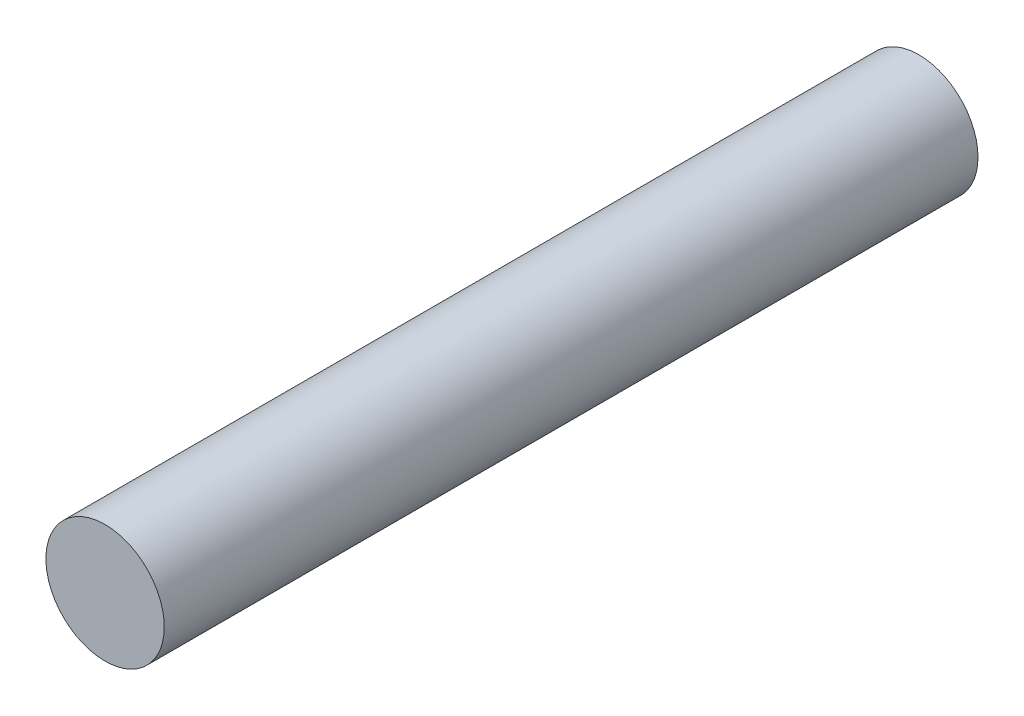
ISO-10303-21;
HEADER;
FILE_DESCRIPTION(('STEP AP214'),'2;1');
FILE_NAME('part.step','',(''),(''),'','','');
FILE_SCHEMA(('AUTOMOTIVE_DESIGN { 1 0 10303 214 1 1 1 1 }'));
ENDSEC;
DATA;
#1=APPLICATION_CONTEXT('core data for automotive mechanical design processes');
#2=APPLICATION_PROTOCOL_DEFINITION('international standard','automotive_design',2000,#1);
#3=PRODUCT_CONTEXT('',#1,'mechanical');
#4=PRODUCT('Part','Part','',(#3));
#5=PRODUCT_RELATED_PRODUCT_CATEGORY('part','',(#4));
#6=PRODUCT_DEFINITION_FORMATION('','',#4);
#7=PRODUCT_DEFINITION_CONTEXT('part definition',#1,'design');
#8=PRODUCT_DEFINITION('design','',#6,#7);
#9=PRODUCT_DEFINITION_SHAPE('','',#8);
#10=(LENGTH_UNIT() NAMED_UNIT(*) SI_UNIT(.MILLI.,.METRE.));
#11=(NAMED_UNIT(*) PLANE_ANGLE_UNIT() SI_UNIT($,.RADIAN.));
#12=(NAMED_UNIT(*) SI_UNIT($,.STERADIAN.) SOLID_ANGLE_UNIT());
#13=UNCERTAINTY_MEASURE_WITH_UNIT(LENGTH_MEASURE(1.E-05),#10,'distance_accuracy_value','');
#14=(GEOMETRIC_REPRESENTATION_CONTEXT(3) GLOBAL_UNCERTAINTY_ASSIGNED_CONTEXT((#13)) GLOBAL_UNIT_ASSIGNED_CONTEXT((#10,
#11,#12)) REPRESENTATION_CONTEXT('',''));
#15=CARTESIAN_POINT('',(0.,0.,0.));
#16=DIRECTION('',(0.,0.,1.));
#17=DIRECTION('',(1.,0.,0.));
#18=AXIS2_PLACEMENT_3D('',#15,#16,#17);
#19=CARTESIAN_POINT('',(0.,0.,55.));
#20=DIRECTION('',(0.,0.,-1.));
#21=DIRECTION('',(-1.,0.,0.));
#22=AXIS2_PLACEMENT_3D('',#19,#20,#21);
#23=CYLINDRICAL_SURFACE('',#22,4.);
#24=CARTESIAN_POINT('',(0.,0.,55.));
#25=DIRECTION('',(0.,0.,1.));
#26=DIRECTION('',(1.,0.,0.));
#27=AXIS2_PLACEMENT_3D('',#24,#25,#26);
#28=CIRCLE('',#27,4.);
#29=CARTESIAN_POINT('',(4.,0.,55.));
#30=VERTEX_POINT('',#29);
#31=EDGE_CURVE('E10',#30,#30,#28,.T.);
#32=ORIENTED_EDGE('',*,*,#31,.F.);
#33=EDGE_LOOP('',(#32));
#34=FACE_BOUND('',#33,.T.);
#35=CARTESIAN_POINT('',(0.,0.,0.));
#36=DIRECTION('',(0.,0.,1.));
#37=DIRECTION('',(1.,0.,0.));
#38=AXIS2_PLACEMENT_3D('',#35,#36,#37);
#39=CIRCLE('',#38,4.);
#40=CARTESIAN_POINT('',(4.,0.,0.));
#41=VERTEX_POINT('',#40);
#42=EDGE_CURVE('E34',#41,#41,#39,.T.);
#43=ORIENTED_EDGE('',*,*,#42,.T.);
#44=EDGE_LOOP('',(#43));
#45=FACE_BOUND('',#44,.T.);
#46=ADVANCED_FACE('F31',(#34,#45),#23,.T.);
#47=CARTESIAN_POINT('',(0.,0.,55.));
#48=DIRECTION('',(0.,0.,1.));
#49=DIRECTION('',(1.,0.,0.));
#50=AXIS2_PLACEMENT_3D('',#47,#48,#49);
#51=PLANE('',#50);
#52=ORIENTED_EDGE('',*,*,#31,.T.);
#53=EDGE_LOOP('',(#52));
#54=FACE_BOUND('',#53,.T.);
#55=ADVANCED_FACE('F46',(#54),#51,.T.);
#56=CARTESIAN_POINT('',(0.,0.,0.));
#57=DIRECTION('',(0.,0.,1.));
#58=DIRECTION('',(1.,0.,0.));
#59=AXIS2_PLACEMENT_3D('',#56,#57,#58);
#60=PLANE('',#59);
#61=ORIENTED_EDGE('',*,*,#42,.F.);
#62=EDGE_LOOP('',(#61));
#63=FACE_BOUND('',#62,.T.);
#64=ADVANCED_FACE('F44',(#63),#60,.F.);
#65=CLOSED_SHELL('',(#46,#55,#64));
#66=MANIFOLD_SOLID_BREP('B2',#65);
#67=ADVANCED_BREP_SHAPE_REPRESENTATION('',(#18,#66),#14);
#68=SHAPE_DEFINITION_REPRESENTATION(#9,#67);
ENDSEC;
END-ISO-10303-21;
